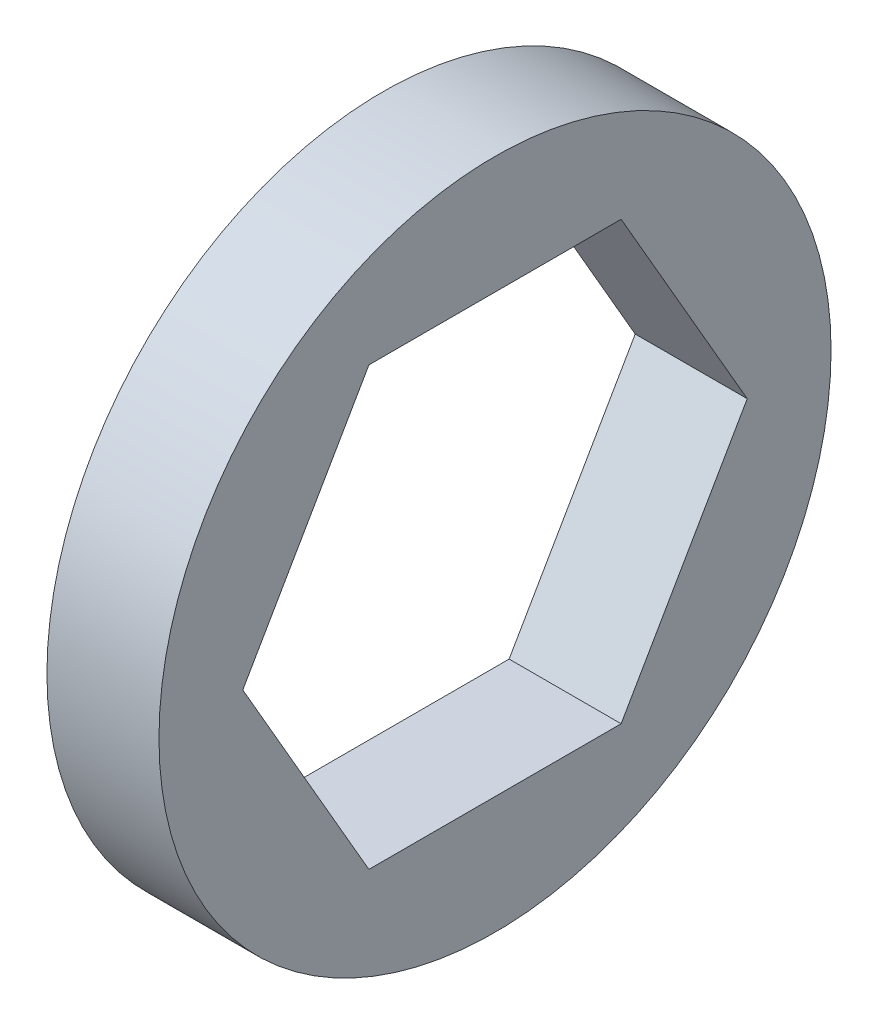
ISO-10303-21;
HEADER;
FILE_DESCRIPTION(('STEP AP214'),'2;1');
FILE_NAME('part.step','',(''),(''),'','','');
FILE_SCHEMA(('AUTOMOTIVE_DESIGN { 1 0 10303 214 1 1 1 1 }'));
ENDSEC;
DATA;
#1=APPLICATION_CONTEXT('core data for automotive mechanical design processes');
#2=APPLICATION_PROTOCOL_DEFINITION('international standard','automotive_design',2000,#1);
#3=PRODUCT_CONTEXT('',#1,'mechanical');
#4=PRODUCT('Part','Part','',(#3));
#5=PRODUCT_RELATED_PRODUCT_CATEGORY('part','',(#4));
#6=PRODUCT_DEFINITION_FORMATION('','',#4);
#7=PRODUCT_DEFINITION_CONTEXT('part definition',#1,'design');
#8=PRODUCT_DEFINITION('design','',#6,#7);
#9=PRODUCT_DEFINITION_SHAPE('','',#8);
#10=(LENGTH_UNIT() NAMED_UNIT(*) SI_UNIT(.MILLI.,.METRE.));
#11=(NAMED_UNIT(*) PLANE_ANGLE_UNIT() SI_UNIT($,.RADIAN.));
#12=(NAMED_UNIT(*) SI_UNIT($,.STERADIAN.) SOLID_ANGLE_UNIT());
#13=UNCERTAINTY_MEASURE_WITH_UNIT(LENGTH_MEASURE(1.E-05),#10,'distance_accuracy_value','');
#14=(GEOMETRIC_REPRESENTATION_CONTEXT(3) GLOBAL_UNCERTAINTY_ASSIGNED_CONTEXT((#13)) GLOBAL_UNIT_ASSIGNED_CONTEXT((#10,
#11,#12)) REPRESENTATION_CONTEXT('',''));
#15=CARTESIAN_POINT('',(0.,0.,0.));
#16=DIRECTION('',(0.,0.,1.));
#17=DIRECTION('',(1.,0.,0.));
#18=AXIS2_PLACEMENT_3D('',#15,#16,#17);
#19=CARTESIAN_POINT('',(2.54,0.,0.));
#20=DIRECTION('',(1.,0.,0.));
#21=DIRECTION('',(0.,0.,-1.));
#22=AXIS2_PLACEMENT_3D('',#19,#20,#21);
#23=PLANE('',#22);
#24=CARTESIAN_POINT('',(2.54,0.,0.));
#25=DIRECTION('',(1.,0.,0.));
#26=DIRECTION('',(0.,0.,-1.));
#27=AXIS2_PLACEMENT_3D('',#24,#25,#26);
#28=CIRCLE('',#27,7.62);
#29=CARTESIAN_POINT('',(2.54,0.,-7.62));
#30=VERTEX_POINT('',#29);
#31=EDGE_CURVE('E11',#30,#30,#28,.T.);
#32=ORIENTED_EDGE('',*,*,#31,.T.);
#33=EDGE_LOOP('',(#32));
#34=FACE_BOUND('',#33,.T.);
#35=DIRECTION('',(0.,0.866025403784439,0.5));
#36=VECTOR('',#35,1.);
#37=CARTESIAN_POINT('',(2.54,0.,-5.71923176659243));
#38=LINE('',#37,#36);
#39=CARTESIAN_POINT('',(2.54,0.,-5.71923176659243));
#40=VERTEX_POINT('',#39);
#41=CARTESIAN_POINT('',(2.54,4.953,-2.85961588329621));
#42=VERTEX_POINT('',#41);
#43=EDGE_CURVE('E98',#40,#42,#38,.T.);
#44=ORIENTED_EDGE('',*,*,#43,.F.);
#45=DIRECTION('',(0.,0.866025403784439,-0.499999999999999));
#46=VECTOR('',#45,1.);
#47=CARTESIAN_POINT('',(2.54,-4.953,-2.85961588329622));
#48=LINE('',#47,#46);
#49=CARTESIAN_POINT('',(2.54,-4.953,-2.85961588329622));
#50=VERTEX_POINT('',#49);
#51=EDGE_CURVE('E90',#50,#40,#48,.T.);
#52=ORIENTED_EDGE('',*,*,#51,.F.);
#53=DIRECTION('',(0.,0.,-1.));
#54=VECTOR('',#53,1.);
#55=CARTESIAN_POINT('',(2.54,-4.953,2.85961588329622));
#56=LINE('',#55,#54);
#57=CARTESIAN_POINT('',(2.54,-4.953,2.85961588329622));
#58=VERTEX_POINT('',#57);
#59=EDGE_CURVE('E118',#58,#50,#56,.T.);
#60=ORIENTED_EDGE('',*,*,#59,.F.);
#61=DIRECTION('',(0.,-0.866025403784439,-0.5));
#62=VECTOR('',#61,1.);
#63=CARTESIAN_POINT('',(2.54,0.,5.71923176659244));
#64=LINE('',#63,#62);
#65=CARTESIAN_POINT('',(2.54,0.,5.71923176659244));
#66=VERTEX_POINT('',#65);
#67=EDGE_CURVE('E116',#66,#58,#64,.T.);
#68=ORIENTED_EDGE('',*,*,#67,.F.);
#69=DIRECTION('',(0.,-0.866025403784439,0.5));
#70=VECTOR('',#69,1.);
#71=CARTESIAN_POINT('',(2.54,4.953,2.85961588329622));
#72=LINE('',#71,#70);
#73=CARTESIAN_POINT('',(2.54,4.953,2.85961588329622));
#74=VERTEX_POINT('',#73);
#75=EDGE_CURVE('E112',#74,#66,#72,.T.);
#76=ORIENTED_EDGE('',*,*,#75,.F.);
#77=DIRECTION('',(0.,0.,1.));
#78=VECTOR('',#77,1.);
#79=CARTESIAN_POINT('',(2.54,4.953,-2.85961588329621));
#80=LINE('',#79,#78);
#81=EDGE_CURVE('E110',#42,#74,#80,.T.);
#82=ORIENTED_EDGE('',*,*,#81,.F.);
#83=EDGE_LOOP('',(#44,#52,#60,#68,#76,#82));
#84=FACE_BOUND('',#83,.T.);
#85=ADVANCED_FACE('F37',(#34,#84),#23,.T.);
#86=CARTESIAN_POINT('',(0.,0.,0.));
#87=DIRECTION('',(1.,0.,0.));
#88=DIRECTION('',(0.,0.,-1.));
#89=AXIS2_PLACEMENT_3D('',#86,#87,#88);
#90=PLANE('',#89);
#91=CARTESIAN_POINT('',(0.,0.,0.));
#92=DIRECTION('',(1.,0.,0.));
#93=DIRECTION('',(0.,0.,-1.));
#94=AXIS2_PLACEMENT_3D('',#91,#92,#93);
#95=CIRCLE('',#94,7.62);
#96=CARTESIAN_POINT('',(0.,0.,-7.62));
#97=VERTEX_POINT('',#96);
#98=EDGE_CURVE('E41',#97,#97,#95,.T.);
#99=ORIENTED_EDGE('',*,*,#98,.F.);
#100=EDGE_LOOP('',(#99));
#101=FACE_BOUND('',#100,.T.);
#102=DIRECTION('',(0.,0.866025403784439,-0.499999999999999));
#103=VECTOR('',#102,1.);
#104=CARTESIAN_POINT('',(0.,-4.953,-2.85961588329622));
#105=LINE('',#104,#103);
#106=CARTESIAN_POINT('',(0.,-4.953,-2.85961588329622));
#107=VERTEX_POINT('',#106);
#108=CARTESIAN_POINT('',(0.,0.,-5.71923176659243));
#109=VERTEX_POINT('',#108);
#110=EDGE_CURVE('E60',#107,#109,#105,.T.);
#111=ORIENTED_EDGE('',*,*,#110,.T.);
#112=DIRECTION('',(0.,0.866025403784439,0.5));
#113=VECTOR('',#112,1.);
#114=CARTESIAN_POINT('',(0.,0.,-5.71923176659243));
#115=LINE('',#114,#113);
#116=CARTESIAN_POINT('',(0.,4.953,-2.85961588329621));
#117=VERTEX_POINT('',#116);
#118=EDGE_CURVE('E105',#109,#117,#115,.T.);
#119=ORIENTED_EDGE('',*,*,#118,.T.);
#120=DIRECTION('',(0.,0.,1.));
#121=VECTOR('',#120,1.);
#122=CARTESIAN_POINT('',(0.,4.953,-2.85961588329621));
#123=LINE('',#122,#121);
#124=CARTESIAN_POINT('',(0.,4.953,2.85961588329622));
#125=VERTEX_POINT('',#124);
#126=EDGE_CURVE('E122',#117,#125,#123,.T.);
#127=ORIENTED_EDGE('',*,*,#126,.T.);
#128=DIRECTION('',(0.,-0.866025403784439,0.5));
#129=VECTOR('',#128,1.);
#130=CARTESIAN_POINT('',(0.,4.953,2.85961588329622));
#131=LINE('',#130,#129);
#132=CARTESIAN_POINT('',(0.,0.,5.71923176659244));
#133=VERTEX_POINT('',#132);
#134=EDGE_CURVE('E125',#125,#133,#131,.T.);
#135=ORIENTED_EDGE('',*,*,#134,.T.);
#136=DIRECTION('',(0.,-0.866025403784439,-0.5));
#137=VECTOR('',#136,1.);
#138=CARTESIAN_POINT('',(0.,0.,5.71923176659244));
#139=LINE('',#138,#137);
#140=CARTESIAN_POINT('',(0.,-4.953,2.85961588329622));
#141=VERTEX_POINT('',#140);
#142=EDGE_CURVE('E128',#133,#141,#139,.T.);
#143=ORIENTED_EDGE('',*,*,#142,.T.);
#144=DIRECTION('',(0.,0.,-1.));
#145=VECTOR('',#144,1.);
#146=CARTESIAN_POINT('',(0.,-4.953,2.85961588329622));
#147=LINE('',#146,#145);
#148=EDGE_CURVE('E99',#141,#107,#147,.T.);
#149=ORIENTED_EDGE('',*,*,#148,.T.);
#150=EDGE_LOOP('',(#111,#119,#127,#135,#143,#149));
#151=FACE_BOUND('',#150,.T.);
#152=ADVANCED_FACE('F145',(#101,#151),#90,.F.);
#153=CARTESIAN_POINT('',(2.54,0.,0.));
#154=DIRECTION('',(-1.,0.,0.));
#155=DIRECTION('',(0.,0.,1.));
#156=AXIS2_PLACEMENT_3D('',#153,#154,#155);
#157=CYLINDRICAL_SURFACE('',#156,7.62);
#158=ORIENTED_EDGE('',*,*,#31,.F.);
#159=EDGE_LOOP('',(#158));
#160=FACE_BOUND('',#159,.T.);
#161=ORIENTED_EDGE('',*,*,#98,.T.);
#162=EDGE_LOOP('',(#161));
#163=FACE_BOUND('',#162,.T.);
#164=ADVANCED_FACE('F39',(#160,#163),#157,.T.);
#165=CARTESIAN_POINT('',(2.54,-4.953,-2.85961588329622));
#166=DIRECTION('',(0.,0.499999999999999,0.866025403784439));
#167=DIRECTION('',(0.,-0.866025403784439,0.5));
#168=AXIS2_PLACEMENT_3D('',#165,#166,#167);
#169=PLANE('',#168);
#170=ORIENTED_EDGE('',*,*,#110,.F.);
#171=DIRECTION('',(-1.,0.,0.));
#172=VECTOR('',#171,1.);
#173=CARTESIAN_POINT('',(2.54,-4.953,-2.85961588329622));
#174=LINE('',#173,#172);
#175=EDGE_CURVE('E94',#50,#107,#174,.T.);
#176=ORIENTED_EDGE('',*,*,#175,.F.);
#177=ORIENTED_EDGE('',*,*,#51,.T.);
#178=DIRECTION('',(-1.,0.,0.));
#179=VECTOR('',#178,1.);
#180=CARTESIAN_POINT('',(2.54,0.,-5.71923176659243));
#181=LINE('',#180,#179);
#182=EDGE_CURVE('E93',#40,#109,#181,.T.);
#183=ORIENTED_EDGE('',*,*,#182,.T.);
#184=EDGE_LOOP('',(#170,#176,#177,#183));
#185=FACE_BOUND('',#184,.T.);
#186=ADVANCED_FACE('F92',(#185),#169,.T.);
#187=CARTESIAN_POINT('',(2.54,0.,-5.71923176659243));
#188=DIRECTION('',(0.,-0.5,0.866025403784439));
#189=DIRECTION('',(0.,-0.866025403784439,-0.5));
#190=AXIS2_PLACEMENT_3D('',#187,#188,#189);
#191=PLANE('',#190);
#192=ORIENTED_EDGE('',*,*,#118,.F.);
#193=ORIENTED_EDGE('',*,*,#182,.F.);
#194=ORIENTED_EDGE('',*,*,#43,.T.);
#195=DIRECTION('',(-1.,0.,0.));
#196=VECTOR('',#195,1.);
#197=CARTESIAN_POINT('',(2.54,4.953,-2.85961588329621));
#198=LINE('',#197,#196);
#199=EDGE_CURVE('E106',#42,#117,#198,.T.);
#200=ORIENTED_EDGE('',*,*,#199,.T.);
#201=EDGE_LOOP('',(#192,#193,#194,#200));
#202=FACE_BOUND('',#201,.T.);
#203=ADVANCED_FACE('F102',(#202),#191,.T.);
#204=CARTESIAN_POINT('',(2.54,4.953,-2.85961588329621));
#205=DIRECTION('',(0.,-1.,0.));
#206=DIRECTION('',(0.,0.,-1.));
#207=AXIS2_PLACEMENT_3D('',#204,#205,#206);
#208=PLANE('',#207);
#209=ORIENTED_EDGE('',*,*,#126,.F.);
#210=ORIENTED_EDGE('',*,*,#199,.F.);
#211=ORIENTED_EDGE('',*,*,#81,.T.);
#212=DIRECTION('',(-1.,0.,0.));
#213=VECTOR('',#212,1.);
#214=CARTESIAN_POINT('',(2.54,4.953,2.85961588329622));
#215=LINE('',#214,#213);
#216=EDGE_CURVE('E137',#74,#125,#215,.T.);
#217=ORIENTED_EDGE('',*,*,#216,.T.);
#218=EDGE_LOOP('',(#209,#210,#211,#217));
#219=FACE_BOUND('',#218,.T.);
#220=ADVANCED_FACE('F141',(#219),#208,.T.);
#221=CARTESIAN_POINT('',(2.54,4.953,2.85961588329622));
#222=DIRECTION('',(0.,-0.5,-0.866025403784439));
#223=DIRECTION('',(0.,0.866025403784439,-0.5));
#224=AXIS2_PLACEMENT_3D('',#221,#222,#223);
#225=PLANE('',#224);
#226=ORIENTED_EDGE('',*,*,#134,.F.);
#227=ORIENTED_EDGE('',*,*,#216,.F.);
#228=ORIENTED_EDGE('',*,*,#75,.T.);
#229=DIRECTION('',(-1.,0.,0.));
#230=VECTOR('',#229,1.);
#231=CARTESIAN_POINT('',(2.54,0.,5.71923176659244));
#232=LINE('',#231,#230);
#233=EDGE_CURVE('E135',#66,#133,#232,.T.);
#234=ORIENTED_EDGE('',*,*,#233,.T.);
#235=EDGE_LOOP('',(#226,#227,#228,#234));
#236=FACE_BOUND('',#235,.T.);
#237=ADVANCED_FACE('F153',(#236),#225,.T.);
#238=CARTESIAN_POINT('',(2.54,0.,5.71923176659244));
#239=DIRECTION('',(0.,0.5,-0.866025403784438));
#240=DIRECTION('',(0.,0.866025403784439,0.5));
#241=AXIS2_PLACEMENT_3D('',#238,#239,#240);
#242=PLANE('',#241);
#243=ORIENTED_EDGE('',*,*,#142,.F.);
#244=ORIENTED_EDGE('',*,*,#233,.F.);
#245=ORIENTED_EDGE('',*,*,#67,.T.);
#246=DIRECTION('',(-1.,0.,0.));
#247=VECTOR('',#246,1.);
#248=CARTESIAN_POINT('',(2.54,-4.953,2.85961588329622));
#249=LINE('',#248,#247);
#250=EDGE_CURVE('E52',#58,#141,#249,.T.);
#251=ORIENTED_EDGE('',*,*,#250,.T.);
#252=EDGE_LOOP('',(#243,#244,#245,#251));
#253=FACE_BOUND('',#252,.T.);
#254=ADVANCED_FACE('F151',(#253),#242,.T.);
#255=CARTESIAN_POINT('',(2.54,-4.953,2.85961588329622));
#256=DIRECTION('',(0.,1.,0.));
#257=DIRECTION('',(0.,0.,1.));
#258=AXIS2_PLACEMENT_3D('',#255,#256,#257);
#259=PLANE('',#258);
#260=ORIENTED_EDGE('',*,*,#148,.F.);
#261=ORIENTED_EDGE('',*,*,#250,.F.);
#262=ORIENTED_EDGE('',*,*,#59,.T.);
#263=ORIENTED_EDGE('',*,*,#175,.T.);
#264=EDGE_LOOP('',(#260,#261,#262,#263));
#265=FACE_BOUND('',#264,.T.);
#266=ADVANCED_FACE('F147',(#265),#259,.T.);
#267=CLOSED_SHELL('',(#85,#152,#164,#186,#203,#220,#237,#254,#266));
#268=MANIFOLD_SOLID_BREP('B2',#267);
#269=ADVANCED_BREP_SHAPE_REPRESENTATION('',(#18,#268),#14);
#270=SHAPE_DEFINITION_REPRESENTATION(#9,#269);
ENDSEC;
END-ISO-10303-21;
